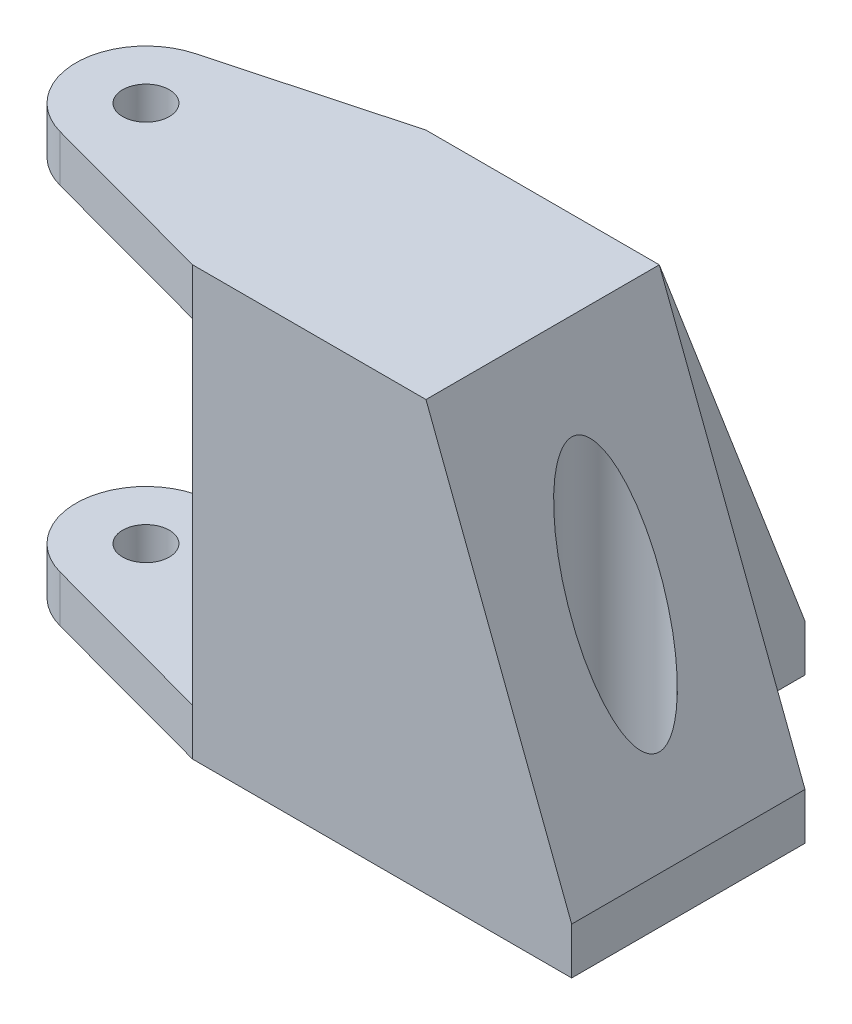
ISO-10303-21;
HEADER;
FILE_DESCRIPTION(('STEP AP214'),'2;1');
FILE_NAME('part.step','',(''),(''),'','','');
FILE_SCHEMA(('AUTOMOTIVE_DESIGN { 1 0 10303 214 1 1 1 1 }'));
ENDSEC;
DATA;
#1=APPLICATION_CONTEXT('core data for automotive mechanical design processes');
#2=APPLICATION_PROTOCOL_DEFINITION('international standard','automotive_design',2000,#1);
#3=PRODUCT_CONTEXT('',#1,'mechanical');
#4=PRODUCT('Part','Part','',(#3));
#5=PRODUCT_RELATED_PRODUCT_CATEGORY('part','',(#4));
#6=PRODUCT_DEFINITION_FORMATION('','',#4);
#7=PRODUCT_DEFINITION_CONTEXT('part definition',#1,'design');
#8=PRODUCT_DEFINITION('design','',#6,#7);
#9=PRODUCT_DEFINITION_SHAPE('','',#8);
#10=(LENGTH_UNIT() NAMED_UNIT(*) SI_UNIT(.MILLI.,.METRE.));
#11=(NAMED_UNIT(*) PLANE_ANGLE_UNIT() SI_UNIT($,.RADIAN.));
#12=(NAMED_UNIT(*) SI_UNIT($,.STERADIAN.) SOLID_ANGLE_UNIT());
#13=UNCERTAINTY_MEASURE_WITH_UNIT(LENGTH_MEASURE(1.E-05),#10,'distance_accuracy_value','');
#14=(GEOMETRIC_REPRESENTATION_CONTEXT(3) GLOBAL_UNCERTAINTY_ASSIGNED_CONTEXT((#13)) GLOBAL_UNIT_ASSIGNED_CONTEXT((#10,
#11,#12)) REPRESENTATION_CONTEXT('',''));
#15=CARTESIAN_POINT('',(0.,0.,0.));
#16=DIRECTION('',(0.,0.,1.));
#17=DIRECTION('',(1.,0.,0.));
#18=AXIS2_PLACEMENT_3D('',#15,#16,#17);
#19=CARTESIAN_POINT('',(-20.,0.,-12.4890829694323));
#20=DIRECTION('',(0.,1.,0.));
#21=DIRECTION('',(0.,0.,1.));
#22=AXIS2_PLACEMENT_3D('',#19,#20,#21);
#23=CYLINDRICAL_SURFACE('',#22,4.);
#24=CARTESIAN_POINT('',(-20.,0.,-12.4890829694323));
#25=DIRECTION('',(0.,1.,0.));
#26=DIRECTION('',(0.,0.,1.));
#27=AXIS2_PLACEMENT_3D('',#24,#25,#26);
#28=CIRCLE('',#27,4.);
#29=CARTESIAN_POINT('',(-20.,0.,-8.48908296943232));
#30=VERTEX_POINT('',#29);
#31=EDGE_CURVE('E181',#30,#30,#28,.T.);
#32=ORIENTED_EDGE('',*,*,#31,.F.);
#33=EDGE_LOOP('',(#32));
#34=FACE_BOUND('',#33,.T.);
#35=CARTESIAN_POINT('',(-20.,5.,-12.4890829694323));
#36=DIRECTION('',(0.,1.,0.));
#37=DIRECTION('',(0.,0.,1.));
#38=AXIS2_PLACEMENT_3D('',#35,#36,#37);
#39=CIRCLE('',#38,4.);
#40=CARTESIAN_POINT('',(-20.,5.,-8.48908296943232));
#41=VERTEX_POINT('',#40);
#42=EDGE_CURVE('E169',#41,#41,#39,.F.);
#43=ORIENTED_EDGE('',*,*,#42,.F.);
#44=EDGE_LOOP('',(#43));
#45=FACE_BOUND('',#44,.T.);
#46=ADVANCED_FACE('F49',(#34,#45),#23,.F.);
#47=CARTESIAN_POINT('',(12.4890829694323,0.,20.));
#48=DIRECTION('',(0.,1.,0.));
#49=DIRECTION('',(0.,0.,1.));
#50=AXIS2_PLACEMENT_3D('',#47,#48,#49);
#51=CYLINDRICAL_SURFACE('',#50,4.);
#52=CARTESIAN_POINT('',(12.4890829694323,0.,20.));
#53=DIRECTION('',(0.,1.,0.));
#54=DIRECTION('',(0.,0.,1.));
#55=AXIS2_PLACEMENT_3D('',#52,#53,#54);
#56=CIRCLE('',#55,4.);
#57=CARTESIAN_POINT('',(12.4890829694323,0.,24.));
#58=VERTEX_POINT('',#57);
#59=EDGE_CURVE('E177',#58,#58,#56,.T.);
#60=ORIENTED_EDGE('',*,*,#59,.F.);
#61=EDGE_LOOP('',(#60));
#62=FACE_BOUND('',#61,.T.);
#63=CARTESIAN_POINT('',(12.4890829694323,5.,20.));
#64=DIRECTION('',(0.,1.,0.));
#65=DIRECTION('',(0.,0.,1.));
#66=AXIS2_PLACEMENT_3D('',#63,#64,#65);
#67=CIRCLE('',#66,4.);
#68=CARTESIAN_POINT('',(12.4890829694323,5.,24.));
#69=VERTEX_POINT('',#68);
#70=EDGE_CURVE('E166',#69,#69,#67,.F.);
#71=ORIENTED_EDGE('',*,*,#70,.F.);
#72=EDGE_LOOP('',(#71));
#73=FACE_BOUND('',#72,.T.);
#74=ADVANCED_FACE('F350',(#62,#73),#51,.F.);
#75=CARTESIAN_POINT('',(-40.,0.,40.));
#76=DIRECTION('',(0.260963361371524,0.,-0.965348705920133));
#77=DIRECTION('',(-0.965348705920133,0.,-0.260963361371524));
#78=AXIS2_PLACEMENT_3D('',#75,#76,#77);
#79=PLANE('',#78);
#80=DIRECTION('',(-0.965348705920133,0.,-0.260963361371524));
#81=VECTOR('',#80,1.);
#82=CARTESIAN_POINT('',(-40.,65.3918284369732,40.));
#83=LINE('',#82,#81);
#84=CARTESIAN_POINT('',(-40.,65.3918284369732,40.));
#85=VERTEX_POINT('',#84);
#86=CARTESIAN_POINT('',(-71.1315603364583,65.3918284369732,31.5841844710416));
#87=VERTEX_POINT('',#86);
#88=EDGE_CURVE('E234',#85,#87,#83,.T.);
#89=ORIENTED_EDGE('',*,*,#88,.F.);
#90=DIRECTION('',(0.,-1.,0.));
#91=VECTOR('',#90,1.);
#92=CARTESIAN_POINT('',(-40.,0.,40.));
#93=LINE('',#92,#91);
#94=CARTESIAN_POINT('',(-40.,73.3918284369733,40.));
#95=VERTEX_POINT('',#94);
#96=EDGE_CURVE('E134',#95,#85,#93,.T.);
#97=ORIENTED_EDGE('',*,*,#96,.F.);
#98=DIRECTION('',(-0.965348705920133,0.,-0.260963361371524));
#99=VECTOR('',#98,1.);
#100=CARTESIAN_POINT('',(-40.,73.3918284369733,40.));
#101=LINE('',#100,#99);
#102=CARTESIAN_POINT('',(-71.1315603364583,73.3918284369733,31.5841844710416));
#103=VERTEX_POINT('',#102);
#104=EDGE_CURVE('E139',#95,#103,#101,.T.);
#105=ORIENTED_EDGE('',*,*,#104,.T.);
#106=DIRECTION('',(0.,1.,0.));
#107=VECTOR('',#106,1.);
#108=CARTESIAN_POINT('',(-71.1315603364583,0.,31.5841844710416));
#109=LINE('',#108,#107);
#110=EDGE_CURVE('E256',#87,#103,#109,.T.);
#111=ORIENTED_EDGE('',*,*,#110,.F.);
#112=EDGE_LOOP('',(#89,#97,#105,#111));
#113=FACE_BOUND('',#112,.T.);
#114=ADVANCED_FACE('F334',(#113),#79,.F.);
#115=DIRECTION('',(0.965348705920133,0.,0.260963361371524));
#116=VECTOR('',#115,1.);
#117=CARTESIAN_POINT('',(-40.,8.,40.));
#118=LINE('',#117,#116);
#119=CARTESIAN_POINT('',(-71.1315603364583,8.,31.5841844710416));
#120=VERTEX_POINT('',#119);
#121=CARTESIAN_POINT('',(-40.,8.,40.));
#122=VERTEX_POINT('',#121);
#123=EDGE_CURVE('E228',#120,#122,#118,.T.);
#124=ORIENTED_EDGE('',*,*,#123,.F.);
#125=CARTESIAN_POINT('',(-71.1315603364583,0.,31.5841844710416));
#126=VERTEX_POINT('',#125);
#127=EDGE_CURVE('E147',#126,#120,#109,.T.);
#128=ORIENTED_EDGE('',*,*,#127,.F.);
#129=DIRECTION('',(-0.965348705920133,0.,-0.260963361371524));
#130=VECTOR('',#129,1.);
#131=CARTESIAN_POINT('',(-40.,0.,40.));
#132=LINE('',#131,#130);
#133=CARTESIAN_POINT('',(-40.,0.,40.));
#134=VERTEX_POINT('',#133);
#135=EDGE_CURVE('E237',#134,#126,#132,.T.);
#136=ORIENTED_EDGE('',*,*,#135,.F.);
#137=EDGE_CURVE('E75',#122,#134,#93,.T.);
#138=ORIENTED_EDGE('',*,*,#137,.F.);
#139=EDGE_LOOP('',(#124,#128,#136,#138));
#140=FACE_BOUND('',#139,.T.);
#141=ADVANCED_FACE('F331',(#140),#79,.F.);
#142=CARTESIAN_POINT('',(-68.,0.,20.));
#143=DIRECTION('',(0.,1.,0.));
#144=DIRECTION('',(0.,0.,1.));
#145=AXIS2_PLACEMENT_3D('',#142,#143,#144);
#146=CYLINDRICAL_SURFACE('',#145,12.);
#147=DIRECTION('',(0.,1.,0.));
#148=VECTOR('',#147,1.);
#149=CARTESIAN_POINT('',(-71.1315603364583,0.,8.41581552895841));
#150=LINE('',#149,#148);
#151=CARTESIAN_POINT('',(-71.1315603364583,65.3918284369732,8.41581552895842));
#152=VERTEX_POINT('',#151);
#153=CARTESIAN_POINT('',(-71.1315603364583,73.3918284369733,8.41581552895841));
#154=VERTEX_POINT('',#153);
#155=EDGE_CURVE('E246',#152,#154,#150,.T.);
#156=ORIENTED_EDGE('',*,*,#155,.F.);
#157=CARTESIAN_POINT('',(-68.,65.3918284369732,20.));
#158=DIRECTION('',(0.,-1.,0.));
#159=DIRECTION('',(0.,0.,-1.));
#160=AXIS2_PLACEMENT_3D('',#157,#158,#159);
#161=CIRCLE('',#160,12.);
#162=EDGE_CURVE('E231',#87,#152,#161,.T.);
#163=ORIENTED_EDGE('',*,*,#162,.F.);
#164=ORIENTED_EDGE('',*,*,#110,.T.);
#165=CARTESIAN_POINT('',(-68.,73.3918284369733,20.));
#166=DIRECTION('',(0.,-1.,0.));
#167=DIRECTION('',(0.,0.,-1.));
#168=AXIS2_PLACEMENT_3D('',#165,#166,#167);
#169=CIRCLE('',#168,12.);
#170=EDGE_CURVE('E248',#103,#154,#169,.T.);
#171=ORIENTED_EDGE('',*,*,#170,.T.);
#172=EDGE_LOOP('',(#156,#163,#164,#171));
#173=FACE_BOUND('',#172,.T.);
#174=ADVANCED_FACE('F340',(#173),#146,.T.);
#175=CARTESIAN_POINT('',(-68.,8.,20.));
#176=DIRECTION('',(0.,1.,0.));
#177=DIRECTION('',(-1.,0.,0.));
#178=AXIS2_PLACEMENT_3D('',#175,#176,#177);
#179=CIRCLE('',#178,12.);
#180=CARTESIAN_POINT('',(-71.1315603364583,8.,8.41581552895842));
#181=VERTEX_POINT('',#180);
#182=EDGE_CURVE('E225',#181,#120,#179,.T.);
#183=ORIENTED_EDGE('',*,*,#182,.F.);
#184=CARTESIAN_POINT('',(-71.1315603364583,0.,8.41581552895841));
#185=VERTEX_POINT('',#184);
#186=EDGE_CURVE('E253',#185,#181,#150,.T.);
#187=ORIENTED_EDGE('',*,*,#186,.F.);
#188=CARTESIAN_POINT('',(-68.,0.,20.));
#189=DIRECTION('',(0.,-1.,0.));
#190=DIRECTION('',(0.,0.,-1.));
#191=AXIS2_PLACEMENT_3D('',#188,#189,#190);
#192=CIRCLE('',#191,12.);
#193=EDGE_CURVE('E240',#126,#185,#192,.T.);
#194=ORIENTED_EDGE('',*,*,#193,.F.);
#195=ORIENTED_EDGE('',*,*,#127,.T.);
#196=EDGE_LOOP('',(#183,#187,#194,#195));
#197=FACE_BOUND('',#196,.T.);
#198=ADVANCED_FACE('F324',(#197),#146,.T.);
#199=CARTESIAN_POINT('',(-40.,0.,0.));
#200=DIRECTION('',(-0.260963361371524,0.,-0.965348705920133));
#201=DIRECTION('',(-0.965348705920133,0.,0.260963361371524));
#202=AXIS2_PLACEMENT_3D('',#199,#200,#201);
#203=PLANE('',#202);
#204=DIRECTION('',(0.,-1.,0.));
#205=VECTOR('',#204,1.);
#206=CARTESIAN_POINT('',(-40.,0.,0.));
#207=LINE('',#206,#205);
#208=CARTESIAN_POINT('',(-40.,73.3918284369733,0.));
#209=VERTEX_POINT('',#208);
#210=CARTESIAN_POINT('',(-40.,65.3918284369732,0.));
#211=VERTEX_POINT('',#210);
#212=EDGE_CURVE('E151',#209,#211,#207,.T.);
#213=ORIENTED_EDGE('',*,*,#212,.T.);
#214=DIRECTION('',(-0.965348705920133,0.,0.260963361371524));
#215=VECTOR('',#214,1.);
#216=CARTESIAN_POINT('',(-40.,65.3918284369732,0.));
#217=LINE('',#216,#215);
#218=EDGE_CURVE('E11',#211,#152,#217,.T.);
#219=ORIENTED_EDGE('',*,*,#218,.T.);
#220=ORIENTED_EDGE('',*,*,#155,.T.);
#221=DIRECTION('',(-0.965348705920133,0.,0.260963361371524));
#222=VECTOR('',#221,1.);
#223=CARTESIAN_POINT('',(-40.,73.3918284369733,0.));
#224=LINE('',#223,#222);
#225=EDGE_CURVE('E241',#209,#154,#224,.T.);
#226=ORIENTED_EDGE('',*,*,#225,.F.);
#227=EDGE_LOOP('',(#213,#219,#220,#226));
#228=FACE_BOUND('',#227,.T.);
#229=ADVANCED_FACE('F308',(#228),#203,.T.);
#230=ORIENTED_EDGE('',*,*,#186,.T.);
#231=DIRECTION('',(0.965348705920133,0.,-0.260963361371524));
#232=VECTOR('',#231,1.);
#233=CARTESIAN_POINT('',(-40.,8.,0.));
#234=LINE('',#233,#232);
#235=CARTESIAN_POINT('',(-40.,8.,0.));
#236=VERTEX_POINT('',#235);
#237=EDGE_CURVE('E58',#181,#236,#234,.T.);
#238=ORIENTED_EDGE('',*,*,#237,.T.);
#239=CARTESIAN_POINT('',(-40.,0.,0.));
#240=VERTEX_POINT('',#239);
#241=EDGE_CURVE('E98',#236,#240,#207,.T.);
#242=ORIENTED_EDGE('',*,*,#241,.T.);
#243=DIRECTION('',(-0.965348705920133,0.,0.260963361371524));
#244=VECTOR('',#243,1.);
#245=CARTESIAN_POINT('',(-40.,0.,0.));
#246=LINE('',#245,#244);
#247=EDGE_CURVE('E244',#240,#185,#246,.T.);
#248=ORIENTED_EDGE('',*,*,#247,.T.);
#249=EDGE_LOOP('',(#230,#238,#242,#248));
#250=FACE_BOUND('',#249,.T.);
#251=ADVANCED_FACE('F321',(#250),#203,.T.);
#252=CARTESIAN_POINT('',(24.9781659388646,8.,40.));
#253=DIRECTION('',(-1.,0.,0.));
#254=DIRECTION('',(0.,-1.,0.));
#255=AXIS2_PLACEMENT_3D('',#252,#253,#254);
#256=PLANE('',#255);
#257=DIRECTION('',(0.,1.,0.));
#258=VECTOR('',#257,1.);
#259=CARTESIAN_POINT('',(24.9781659388646,8.,0.));
#260=LINE('',#259,#258);
#261=CARTESIAN_POINT('',(24.9781659388646,0.,0.));
#262=VERTEX_POINT('',#261);
#263=CARTESIAN_POINT('',(24.9781659388646,8.,0.));
#264=VERTEX_POINT('',#263);
#265=EDGE_CURVE('E145',#262,#264,#260,.T.);
#266=ORIENTED_EDGE('',*,*,#265,.T.);
#267=DIRECTION('',(0.,0.,-1.));
#268=VECTOR('',#267,1.);
#269=CARTESIAN_POINT('',(24.9781659388646,8.,40.));
#270=LINE('',#269,#268);
#271=CARTESIAN_POINT('',(24.9781659388646,8.,40.));
#272=VERTEX_POINT('',#271);
#273=EDGE_CURVE('E133',#272,#264,#270,.T.);
#274=ORIENTED_EDGE('',*,*,#273,.F.);
#275=DIRECTION('',(0.,1.,0.));
#276=VECTOR('',#275,1.);
#277=CARTESIAN_POINT('',(24.9781659388646,8.,40.));
#278=LINE('',#277,#276);
#279=CARTESIAN_POINT('',(24.9781659388646,0.,40.));
#280=VERTEX_POINT('',#279);
#281=EDGE_CURVE('E107',#280,#272,#278,.T.);
#282=ORIENTED_EDGE('',*,*,#281,.F.);
#283=DIRECTION('',(0.,0.,-1.));
#284=VECTOR('',#283,1.);
#285=CARTESIAN_POINT('',(24.9781659388646,0.,40.));
#286=LINE('',#285,#284);
#287=EDGE_CURVE('E158',#280,#262,#286,.T.);
#288=ORIENTED_EDGE('',*,*,#287,.T.);
#289=EDGE_LOOP('',(#266,#274,#282,#288));
#290=FACE_BOUND('',#289,.T.);
#291=ADVANCED_FACE('F51',(#290),#256,.F.);
#292=CARTESIAN_POINT('',(0.,73.3918284369733,40.));
#293=DIRECTION('',(-0.934168977671047,-0.35683094198378,0.));
#294=DIRECTION('',(0.35683094198378,-0.934168977671047,0.));
#295=AXIS2_PLACEMENT_3D('',#292,#293,#294);
#296=PLANE('',#295);
#297=CARTESIAN_POINT('',(12.4890829694323,40.6959142184866,20.));
#298=DIRECTION('',(-0.934168977671047,-0.35683094198378,0.));
#299=DIRECTION('',(0.35683094198378,-0.934168977671047,0.));
#300=AXIS2_PLACEMENT_3D('',#297,#298,#299);
#301=ELLIPSE('',#300,21.0183566433567,7.5);
#302=CARTESIAN_POINT('',(19.9890829694323,21.0612174806367,20.));
#303=VERTEX_POINT('',#302);
#304=EDGE_CURVE('E53',#303,#303,#301,.F.);
#305=ORIENTED_EDGE('',*,*,#304,.F.);
#306=EDGE_LOOP('',(#305));
#307=FACE_BOUND('',#306,.T.);
#308=DIRECTION('',(-0.35683094198378,0.934168977671046,0.));
#309=VECTOR('',#308,1.);
#310=CARTESIAN_POINT('',(0.,73.3918284369733,0.));
#311=LINE('',#310,#309);
#312=CARTESIAN_POINT('',(0.,73.3918284369733,0.));
#313=VERTEX_POINT('',#312);
#314=EDGE_CURVE('E129',#264,#313,#311,.T.);
#315=ORIENTED_EDGE('',*,*,#314,.T.);
#316=DIRECTION('',(0.,0.,-1.));
#317=VECTOR('',#316,1.);
#318=CARTESIAN_POINT('',(0.,73.3918284369733,40.));
#319=LINE('',#318,#317);
#320=CARTESIAN_POINT('',(0.,73.3918284369733,40.));
#321=VERTEX_POINT('',#320);
#322=EDGE_CURVE('E126',#321,#313,#319,.T.);
#323=ORIENTED_EDGE('',*,*,#322,.F.);
#324=DIRECTION('',(-0.35683094198378,0.934168977671046,0.));
#325=VECTOR('',#324,1.);
#326=CARTESIAN_POINT('',(0.,73.3918284369733,40.));
#327=LINE('',#326,#325);
#328=EDGE_CURVE('E114',#272,#321,#327,.T.);
#329=ORIENTED_EDGE('',*,*,#328,.F.);
#330=ORIENTED_EDGE('',*,*,#273,.T.);
#331=EDGE_LOOP('',(#315,#323,#329,#330));
#332=FACE_BOUND('',#331,.T.);
#333=ADVANCED_FACE('F127',(#307,#332),#296,.F.);
#334=CARTESIAN_POINT('',(-40.,73.3918284369733,40.));
#335=DIRECTION('',(0.,-1.,0.));
#336=DIRECTION('',(0.,0.,-1.));
#337=AXIS2_PLACEMENT_3D('',#334,#335,#336);
#338=PLANE('',#337);
#339=CARTESIAN_POINT('',(-68.,73.3918284369733,20.));
#340=DIRECTION('',(0.,1.,0.));
#341=DIRECTION('',(0.,0.,1.));
#342=AXIS2_PLACEMENT_3D('',#339,#340,#341);
#343=CIRCLE('',#342,4.00000000000001);
#344=CARTESIAN_POINT('',(-68.,73.3918284369733,24.));
#345=VERTEX_POINT('',#344);
#346=EDGE_CURVE('E186',#345,#345,#343,.T.);
#347=ORIENTED_EDGE('',*,*,#346,.F.);
#348=EDGE_LOOP('',(#347));
#349=FACE_BOUND('',#348,.T.);
#350=DIRECTION('',(-1.,0.,0.));
#351=VECTOR('',#350,1.);
#352=CARTESIAN_POINT('',(-40.,73.3918284369733,0.));
#353=LINE('',#352,#351);
#354=EDGE_CURVE('E149',#313,#209,#353,.T.);
#355=ORIENTED_EDGE('',*,*,#354,.T.);
#356=ORIENTED_EDGE('',*,*,#225,.T.);
#357=ORIENTED_EDGE('',*,*,#170,.F.);
#358=ORIENTED_EDGE('',*,*,#104,.F.);
#359=DIRECTION('',(-1.,0.,0.));
#360=VECTOR('',#359,1.);
#361=CARTESIAN_POINT('',(-40.,73.3918284369733,40.));
#362=LINE('',#361,#360);
#363=EDGE_CURVE('E119',#321,#95,#362,.T.);
#364=ORIENTED_EDGE('',*,*,#363,.F.);
#365=ORIENTED_EDGE('',*,*,#322,.T.);
#366=EDGE_LOOP('',(#355,#356,#357,#358,#364,#365));
#367=FACE_BOUND('',#366,.T.);
#368=ADVANCED_FACE('F136',(#349,#367),#338,.F.);
#369=CARTESIAN_POINT('',(0.,0.,40.));
#370=DIRECTION('',(0.,1.,0.));
#371=DIRECTION('',(0.,0.,1.));
#372=AXIS2_PLACEMENT_3D('',#369,#370,#371);
#373=PLANE('',#372);
#374=CARTESIAN_POINT('',(-68.,0.,20.));
#375=DIRECTION('',(0.,1.,0.));
#376=DIRECTION('',(0.,0.,1.));
#377=AXIS2_PLACEMENT_3D('',#374,#375,#376);
#378=CIRCLE('',#377,4.00000000000001);
#379=CARTESIAN_POINT('',(-68.,0.,24.));
#380=VERTEX_POINT('',#379);
#381=EDGE_CURVE('E165',#380,#380,#378,.T.);
#382=ORIENTED_EDGE('',*,*,#381,.T.);
#383=EDGE_LOOP('',(#382));
#384=FACE_BOUND('',#383,.T.);
#385=ORIENTED_EDGE('',*,*,#31,.T.);
#386=EDGE_LOOP('',(#385));
#387=FACE_BOUND('',#386,.T.);
#388=ORIENTED_EDGE('',*,*,#59,.T.);
#389=EDGE_LOOP('',(#388));
#390=FACE_BOUND('',#389,.T.);
#391=ORIENTED_EDGE('',*,*,#247,.F.);
#392=DIRECTION('',(0.,0.,-1.));
#393=VECTOR('',#392,1.);
#394=CARTESIAN_POINT('',(-40.,0.,0.));
#395=LINE('',#394,#393);
#396=CARTESIAN_POINT('',(-40.,0.,-24.9781659388646));
#397=VERTEX_POINT('',#396);
#398=EDGE_CURVE('E193',#240,#397,#395,.T.);
#399=ORIENTED_EDGE('',*,*,#398,.T.);
#400=DIRECTION('',(1.,0.,0.));
#401=VECTOR('',#400,1.);
#402=CARTESIAN_POINT('',(-40.,0.,-24.9781659388646));
#403=LINE('',#402,#401);
#404=CARTESIAN_POINT('',(0.,0.,-24.9781659388646));
#405=VERTEX_POINT('',#404);
#406=EDGE_CURVE('E203',#397,#405,#403,.T.);
#407=ORIENTED_EDGE('',*,*,#406,.T.);
#408=DIRECTION('',(0.,0.,-1.));
#409=VECTOR('',#408,1.);
#410=CARTESIAN_POINT('',(0.,0.,0.));
#411=LINE('',#410,#409);
#412=CARTESIAN_POINT('',(0.,0.,0.));
#413=VERTEX_POINT('',#412);
#414=EDGE_CURVE('E206',#413,#405,#411,.T.);
#415=ORIENTED_EDGE('',*,*,#414,.F.);
#416=DIRECTION('',(1.,0.,0.));
#417=VECTOR('',#416,1.);
#418=CARTESIAN_POINT('',(0.,0.,0.));
#419=LINE('',#418,#417);
#420=EDGE_CURVE('E154',#413,#262,#419,.T.);
#421=ORIENTED_EDGE('',*,*,#420,.T.);
#422=ORIENTED_EDGE('',*,*,#287,.F.);
#423=DIRECTION('',(1.,0.,0.));
#424=VECTOR('',#423,1.);
#425=CARTESIAN_POINT('',(0.,0.,40.));
#426=LINE('',#425,#424);
#427=EDGE_CURVE('E155',#134,#280,#426,.T.);
#428=ORIENTED_EDGE('',*,*,#427,.F.);
#429=ORIENTED_EDGE('',*,*,#135,.T.);
#430=ORIENTED_EDGE('',*,*,#193,.T.);
#431=EDGE_LOOP('',(#391,#399,#407,#415,#421,#422,#428,#429,#430));
#432=FACE_BOUND('',#431,.T.);
#433=ADVANCED_FACE('F262',(#384,#387,#390,#432),#373,.F.);
#434=CARTESIAN_POINT('',(0.,0.,40.));
#435=DIRECTION('',(0.,0.,-1.));
#436=DIRECTION('',(-1.,0.,0.));
#437=AXIS2_PLACEMENT_3D('',#434,#435,#436);
#438=PLANE('',#437);
#439=ORIENTED_EDGE('',*,*,#427,.T.);
#440=ORIENTED_EDGE('',*,*,#281,.T.);
#441=ORIENTED_EDGE('',*,*,#328,.T.);
#442=ORIENTED_EDGE('',*,*,#363,.T.);
#443=ORIENTED_EDGE('',*,*,#96,.T.);
#444=DIRECTION('',(0.,1.,0.));
#445=VECTOR('',#444,1.);
#446=CARTESIAN_POINT('',(-40.,0.,40.));
#447=LINE('',#446,#445);
#448=EDGE_CURVE('E223',#122,#85,#447,.T.);
#449=ORIENTED_EDGE('',*,*,#448,.F.);
#450=ORIENTED_EDGE('',*,*,#137,.T.);
#451=EDGE_LOOP('',(#439,#440,#441,#442,#443,#449,#450));
#452=FACE_BOUND('',#451,.T.);
#453=ADVANCED_FACE('F116',(#452),#438,.F.);
#454=CARTESIAN_POINT('',(0.,0.,0.));
#455=DIRECTION('',(0.,0.,-1.));
#456=DIRECTION('',(-1.,0.,0.));
#457=AXIS2_PLACEMENT_3D('',#454,#455,#456);
#458=PLANE('',#457);
#459=DIRECTION('',(0.,-1.,0.));
#460=VECTOR('',#459,1.);
#461=CARTESIAN_POINT('',(0.,73.3918284369733,0.));
#462=LINE('',#461,#460);
#463=EDGE_CURVE('E192',#313,#413,#462,.T.);
#464=ORIENTED_EDGE('',*,*,#463,.F.);
#465=ORIENTED_EDGE('',*,*,#314,.F.);
#466=ORIENTED_EDGE('',*,*,#265,.F.);
#467=ORIENTED_EDGE('',*,*,#420,.F.);
#468=EDGE_LOOP('',(#464,#465,#466,#467));
#469=FACE_BOUND('',#468,.T.);
#470=ADVANCED_FACE('F267',(#469),#458,.T.);
#471=CARTESIAN_POINT('',(-40.,65.3918284369732,73.));
#472=DIRECTION('',(0.,-1.,0.));
#473=DIRECTION('',(0.,0.,-1.));
#474=AXIS2_PLACEMENT_3D('',#471,#472,#473);
#475=PLANE('',#474);
#476=CARTESIAN_POINT('',(-68.,65.3918284369732,20.));
#477=DIRECTION('',(0.,-1.,0.));
#478=DIRECTION('',(0.,0.,-1.));
#479=AXIS2_PLACEMENT_3D('',#476,#477,#478);
#480=CIRCLE('',#479,4.00000000000001);
#481=CARTESIAN_POINT('',(-68.,65.3918284369732,16.));
#482=VERTEX_POINT('',#481);
#483=EDGE_CURVE('E164',#482,#482,#480,.T.);
#484=ORIENTED_EDGE('',*,*,#483,.F.);
#485=EDGE_LOOP('',(#484));
#486=FACE_BOUND('',#485,.T.);
#487=ORIENTED_EDGE('',*,*,#88,.T.);
#488=ORIENTED_EDGE('',*,*,#162,.T.);
#489=ORIENTED_EDGE('',*,*,#218,.F.);
#490=DIRECTION('',(0.,0.,-1.));
#491=VECTOR('',#490,1.);
#492=CARTESIAN_POINT('',(-40.,65.3918284369732,73.));
#493=LINE('',#492,#491);
#494=EDGE_CURVE('E66',#85,#211,#493,.T.);
#495=ORIENTED_EDGE('',*,*,#494,.F.);
#496=EDGE_LOOP('',(#487,#488,#489,#495));
#497=FACE_BOUND('',#496,.T.);
#498=ADVANCED_FACE('F338',(#486,#497),#475,.T.);
#499=CARTESIAN_POINT('',(-80.,8.,73.));
#500=DIRECTION('',(0.,1.,0.));
#501=DIRECTION('',(-1.,0.,0.));
#502=AXIS2_PLACEMENT_3D('',#499,#500,#501);
#503=PLANE('',#502);
#504=CARTESIAN_POINT('',(-68.,8.,20.));
#505=DIRECTION('',(0.,1.,0.));
#506=DIRECTION('',(-1.,0.,0.));
#507=AXIS2_PLACEMENT_3D('',#504,#505,#506);
#508=CIRCLE('',#507,4.00000000000001);
#509=CARTESIAN_POINT('',(-72.,8.,20.));
#510=VERTEX_POINT('',#509);
#511=EDGE_CURVE('E161',#510,#510,#508,.T.);
#512=ORIENTED_EDGE('',*,*,#511,.F.);
#513=EDGE_LOOP('',(#512));
#514=FACE_BOUND('',#513,.T.);
#515=ORIENTED_EDGE('',*,*,#123,.T.);
#516=DIRECTION('',(0.,0.,-1.));
#517=VECTOR('',#516,1.);
#518=CARTESIAN_POINT('',(-40.,8.,73.));
#519=LINE('',#518,#517);
#520=EDGE_CURVE('E220',#122,#236,#519,.T.);
#521=ORIENTED_EDGE('',*,*,#520,.T.);
#522=ORIENTED_EDGE('',*,*,#237,.F.);
#523=ORIENTED_EDGE('',*,*,#182,.T.);
#524=EDGE_LOOP('',(#515,#521,#522,#523));
#525=FACE_BOUND('',#524,.T.);
#526=ADVANCED_FACE('F328',(#514,#525),#503,.T.);
#527=CARTESIAN_POINT('',(-40.,8.,73.));
#528=DIRECTION('',(-1.,0.,0.));
#529=DIRECTION('',(0.,0.,1.));
#530=AXIS2_PLACEMENT_3D('',#527,#528,#529);
#531=PLANE('',#530);
#532=ORIENTED_EDGE('',*,*,#448,.T.);
#533=ORIENTED_EDGE('',*,*,#494,.T.);
#534=ORIENTED_EDGE('',*,*,#212,.F.);
#535=DIRECTION('',(0.,0.934168977671046,0.356830941983781));
#536=VECTOR('',#535,1.);
#537=CARTESIAN_POINT('',(-40.,8.00000000000001,-24.9781659388646));
#538=LINE('',#537,#536);
#539=CARTESIAN_POINT('',(-40.,8.00000000000001,-24.9781659388646));
#540=VERTEX_POINT('',#539);
#541=EDGE_CURVE('E200',#540,#209,#538,.T.);
#542=ORIENTED_EDGE('',*,*,#541,.F.);
#543=DIRECTION('',(0.,1.,0.));
#544=VECTOR('',#543,1.);
#545=CARTESIAN_POINT('',(-40.,0.,-24.9781659388646));
#546=LINE('',#545,#544);
#547=EDGE_CURVE('E196',#397,#540,#546,.T.);
#548=ORIENTED_EDGE('',*,*,#547,.F.);
#549=ORIENTED_EDGE('',*,*,#398,.F.);
#550=ORIENTED_EDGE('',*,*,#241,.F.);
#551=ORIENTED_EDGE('',*,*,#520,.F.);
#552=EDGE_LOOP('',(#532,#533,#534,#542,#548,#549,#550,#551));
#553=FACE_BOUND('',#552,.T.);
#554=ADVANCED_FACE('F310',(#553),#531,.T.);
#555=CARTESIAN_POINT('',(-40.,8.00000000000001,-24.9781659388646));
#556=DIRECTION('',(0.,0.356830941983781,-0.934168977671046));
#557=DIRECTION('',(0.,0.934168977671046,0.356830941983781));
#558=AXIS2_PLACEMENT_3D('',#555,#556,#557);
#559=PLANE('',#558);
#560=CARTESIAN_POINT('',(-20.,40.6959142184866,-12.4890829694323));
#561=DIRECTION('',(0.,0.356830941983781,-0.934168977671046));
#562=DIRECTION('',(0.,-0.934168977671046,-0.356830941983781));
#563=AXIS2_PLACEMENT_3D('',#560,#561,#562);
#564=ELLIPSE('',#563,21.0183566433566,7.5);
#565=CARTESIAN_POINT('',(-20.,21.0612174806367,-19.9890829694323));
#566=VERTEX_POINT('',#565);
#567=EDGE_CURVE('E172',#566,#566,#564,.F.);
#568=ORIENTED_EDGE('',*,*,#567,.T.);
#569=EDGE_LOOP('',(#568));
#570=FACE_BOUND('',#569,.T.);
#571=DIRECTION('',(0.,0.934168977671046,0.356830941983781));
#572=VECTOR('',#571,1.);
#573=CARTESIAN_POINT('',(0.,8.00000000000001,-24.9781659388646));
#574=LINE('',#573,#572);
#575=CARTESIAN_POINT('',(0.,8.00000000000001,-24.9781659388646));
#576=VERTEX_POINT('',#575);
#577=EDGE_CURVE('E197',#576,#313,#574,.T.);
#578=ORIENTED_EDGE('',*,*,#577,.F.);
#579=DIRECTION('',(1.,0.,0.));
#580=VECTOR('',#579,1.);
#581=CARTESIAN_POINT('',(-40.,8.00000000000001,-24.9781659388646));
#582=LINE('',#581,#580);
#583=EDGE_CURVE('E214',#540,#576,#582,.T.);
#584=ORIENTED_EDGE('',*,*,#583,.F.);
#585=ORIENTED_EDGE('',*,*,#541,.T.);
#586=ORIENTED_EDGE('',*,*,#354,.F.);
#587=EDGE_LOOP('',(#578,#584,#585,#586));
#588=FACE_BOUND('',#587,.T.);
#589=ADVANCED_FACE('F313',(#570,#588),#559,.T.);
#590=CARTESIAN_POINT('',(-40.,0.,-24.9781659388646));
#591=DIRECTION('',(0.,0.,-1.));
#592=DIRECTION('',(-1.,0.,0.));
#593=AXIS2_PLACEMENT_3D('',#590,#591,#592);
#594=PLANE('',#593);
#595=DIRECTION('',(0.,1.,0.));
#596=VECTOR('',#595,1.);
#597=CARTESIAN_POINT('',(0.,0.,-24.9781659388646));
#598=LINE('',#597,#596);
#599=EDGE_CURVE('E209',#405,#576,#598,.T.);
#600=ORIENTED_EDGE('',*,*,#599,.F.);
#601=ORIENTED_EDGE('',*,*,#406,.F.);
#602=ORIENTED_EDGE('',*,*,#547,.T.);
#603=ORIENTED_EDGE('',*,*,#583,.T.);
#604=EDGE_LOOP('',(#600,#601,#602,#603));
#605=FACE_BOUND('',#604,.T.);
#606=ADVANCED_FACE('F317',(#605),#594,.T.);
#607=CARTESIAN_POINT('',(0.,0.,0.));
#608=DIRECTION('',(1.,0.,0.));
#609=DIRECTION('',(0.,0.,-1.));
#610=AXIS2_PLACEMENT_3D('',#607,#608,#609);
#611=PLANE('',#610);
#612=ORIENTED_EDGE('',*,*,#463,.T.);
#613=ORIENTED_EDGE('',*,*,#414,.T.);
#614=ORIENTED_EDGE('',*,*,#599,.T.);
#615=ORIENTED_EDGE('',*,*,#577,.T.);
#616=EDGE_LOOP('',(#612,#613,#614,#615));
#617=FACE_BOUND('',#616,.T.);
#618=ADVANCED_FACE('F270',(#617),#611,.T.);
#619=CARTESIAN_POINT('',(-68.,0.,20.));
#620=DIRECTION('',(0.,1.,0.));
#621=DIRECTION('',(0.,0.,1.));
#622=AXIS2_PLACEMENT_3D('',#619,#620,#621);
#623=CYLINDRICAL_SURFACE('',#622,4.00000000000001);
#624=ORIENTED_EDGE('',*,*,#511,.T.);
#625=EDGE_LOOP('',(#624));
#626=FACE_BOUND('',#625,.T.);
#627=ORIENTED_EDGE('',*,*,#381,.F.);
#628=EDGE_LOOP('',(#627));
#629=FACE_BOUND('',#628,.T.);
#630=ADVANCED_FACE('F362',(#626,#629),#623,.F.);
#631=ORIENTED_EDGE('',*,*,#483,.T.);
#632=EDGE_LOOP('',(#631));
#633=FACE_BOUND('',#632,.T.);
#634=ORIENTED_EDGE('',*,*,#346,.T.);
#635=EDGE_LOOP('',(#634));
#636=FACE_BOUND('',#635,.T.);
#637=ADVANCED_FACE('F507',(#633,#636),#623,.F.);
#638=CARTESIAN_POINT('',(12.4890829694323,73.3918284369733,20.));
#639=DIRECTION('',(0.,-1.,0.));
#640=DIRECTION('',(0.,0.,-1.));
#641=AXIS2_PLACEMENT_3D('',#638,#639,#640);
#642=CYLINDRICAL_SURFACE('',#641,7.5);
#643=CARTESIAN_POINT('',(12.4890829694323,5.,20.));
#644=DIRECTION('',(0.,1.,0.));
#645=DIRECTION('',(0.,0.,1.));
#646=AXIS2_PLACEMENT_3D('',#643,#644,#645);
#647=CIRCLE('',#646,7.5);
#648=CARTESIAN_POINT('',(12.4890829694323,5.,27.5));
#649=VERTEX_POINT('',#648);
#650=EDGE_CURVE('E567',#649,#649,#647,.T.);
#651=ORIENTED_EDGE('',*,*,#650,.F.);
#652=EDGE_LOOP('',(#651));
#653=FACE_BOUND('',#652,.T.);
#654=ORIENTED_EDGE('',*,*,#304,.T.);
#655=EDGE_LOOP('',(#654));
#656=FACE_BOUND('',#655,.T.);
#657=ADVANCED_FACE('F515',(#653,#656),#642,.F.);
#658=CARTESIAN_POINT('',(12.4890829694323,5.,20.));
#659=DIRECTION('',(0.,1.,0.));
#660=DIRECTION('',(0.,0.,1.));
#661=AXIS2_PLACEMENT_3D('',#658,#659,#660);
#662=PLANE('',#661);
#663=ORIENTED_EDGE('',*,*,#650,.T.);
#664=EDGE_LOOP('',(#663));
#665=FACE_BOUND('',#664,.T.);
#666=ORIENTED_EDGE('',*,*,#70,.T.);
#667=EDGE_LOOP('',(#666));
#668=FACE_BOUND('',#667,.T.);
#669=ADVANCED_FACE('F532',(#665,#668),#662,.T.);
#670=CARTESIAN_POINT('',(-20.,5.,-12.4890829694323));
#671=DIRECTION('',(0.,1.,0.));
#672=DIRECTION('',(0.,0.,1.));
#673=AXIS2_PLACEMENT_3D('',#670,#671,#672);
#674=PLANE('',#673);
#675=CARTESIAN_POINT('',(-20.,5.,-12.4890829694323));
#676=DIRECTION('',(0.,1.,0.));
#677=DIRECTION('',(0.,0.,1.));
#678=AXIS2_PLACEMENT_3D('',#675,#676,#677);
#679=CIRCLE('',#678,7.5);
#680=CARTESIAN_POINT('',(-20.,5.,-4.98908296943232));
#681=VERTEX_POINT('',#680);
#682=EDGE_CURVE('E170',#681,#681,#679,.T.);
#683=ORIENTED_EDGE('',*,*,#682,.T.);
#684=EDGE_LOOP('',(#683));
#685=FACE_BOUND('',#684,.T.);
#686=ORIENTED_EDGE('',*,*,#42,.T.);
#687=EDGE_LOOP('',(#686));
#688=FACE_BOUND('',#687,.T.);
#689=ADVANCED_FACE('F542',(#685,#688),#674,.T.);
#690=CARTESIAN_POINT('',(-20.,73.3918284369733,-12.4890829694323));
#691=DIRECTION('',(0.,-1.,0.));
#692=DIRECTION('',(0.,0.,-1.));
#693=AXIS2_PLACEMENT_3D('',#690,#691,#692);
#694=CYLINDRICAL_SURFACE('',#693,7.5);
#695=ORIENTED_EDGE('',*,*,#567,.F.);
#696=EDGE_LOOP('',(#695));
#697=FACE_BOUND('',#696,.T.);
#698=ORIENTED_EDGE('',*,*,#682,.F.);
#699=EDGE_LOOP('',(#698));
#700=FACE_BOUND('',#699,.T.);
#701=ADVANCED_FACE('F551',(#697,#700),#694,.F.);
#702=CLOSED_SHELL('',(#46,#74,#114,#141,#174,#198,#229,#251,#291,#333,#368,#433,#453,#470,#498,
#526,#554,#589,#606,#618,#630,#637,#657,#669,#689,#701));
#703=MANIFOLD_SOLID_BREP('B2',#702);
#704=ADVANCED_BREP_SHAPE_REPRESENTATION('',(#18,#703),#14);
#705=SHAPE_DEFINITION_REPRESENTATION(#9,#704);
ENDSEC;
END-ISO-10303-21;
